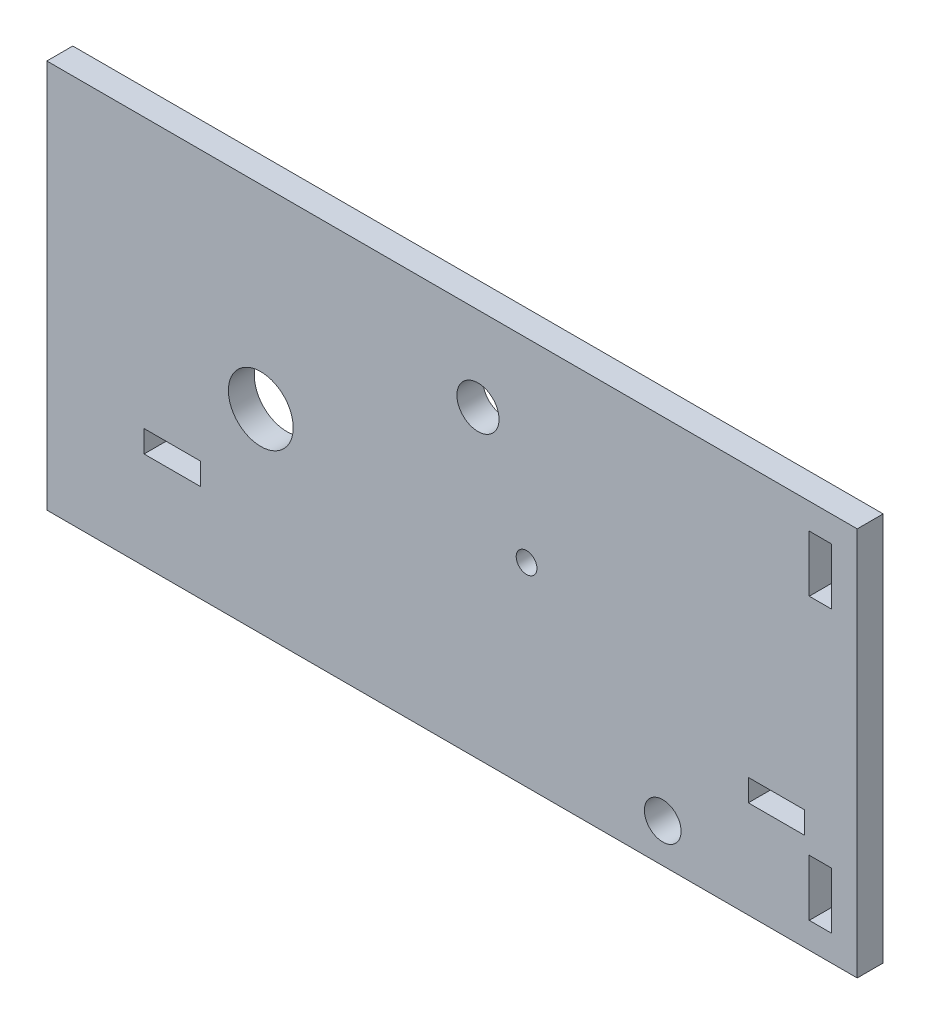
ISO-10303-21;
HEADER;
FILE_DESCRIPTION(('STEP AP214'),'2;1');
FILE_NAME('part.step','',(''),(''),'','','');
FILE_SCHEMA(('AUTOMOTIVE_DESIGN { 1 0 10303 214 1 1 1 1 }'));
ENDSEC;
DATA;
#1=APPLICATION_CONTEXT('core data for automotive mechanical design processes');
#2=APPLICATION_PROTOCOL_DEFINITION('international standard','automotive_design',2000,#1);
#3=PRODUCT_CONTEXT('',#1,'mechanical');
#4=PRODUCT('Part','Part','',(#3));
#5=PRODUCT_RELATED_PRODUCT_CATEGORY('part','',(#4));
#6=PRODUCT_DEFINITION_FORMATION('','',#4);
#7=PRODUCT_DEFINITION_CONTEXT('part definition',#1,'design');
#8=PRODUCT_DEFINITION('design','',#6,#7);
#9=PRODUCT_DEFINITION_SHAPE('','',#8);
#10=(LENGTH_UNIT() NAMED_UNIT(*) SI_UNIT(.MILLI.,.METRE.));
#11=(NAMED_UNIT(*) PLANE_ANGLE_UNIT() SI_UNIT($,.RADIAN.));
#12=(NAMED_UNIT(*) SI_UNIT($,.STERADIAN.) SOLID_ANGLE_UNIT());
#13=UNCERTAINTY_MEASURE_WITH_UNIT(LENGTH_MEASURE(1.E-05),#10,'distance_accuracy_value','');
#14=(GEOMETRIC_REPRESENTATION_CONTEXT(3) GLOBAL_UNCERTAINTY_ASSIGNED_CONTEXT((#13)) GLOBAL_UNIT_ASSIGNED_CONTEXT((#10,
#11,#12)) REPRESENTATION_CONTEXT('',''));
#15=CARTESIAN_POINT('',(0.,0.,0.));
#16=DIRECTION('',(0.,0.,1.));
#17=DIRECTION('',(1.,0.,0.));
#18=AXIS2_PLACEMENT_3D('',#15,#16,#17);
#19=CARTESIAN_POINT('',(0.,0.,4.));
#20=DIRECTION('',(0.,0.,-1.));
#21=DIRECTION('',(-1.,0.,0.));
#22=AXIS2_PLACEMENT_3D('',#19,#20,#21);
#23=PLANE('',#22);
#24=DIRECTION('',(0.,-1.,0.));
#25=VECTOR('',#24,1.);
#26=CARTESIAN_POINT('',(38.6,-17.3,4.));
#27=LINE('',#26,#25);
#28=CARTESIAN_POINT('',(38.6,-17.3,4.));
#29=VERTEX_POINT('',#28);
#30=CARTESIAN_POINT('',(38.6,-26.,4.));
#31=VERTEX_POINT('',#30);
#32=EDGE_CURVE('E211',#29,#31,#27,.T.);
#33=ORIENTED_EDGE('',*,*,#32,.F.);
#34=DIRECTION('',(-1.,0.,0.));
#35=VECTOR('',#34,1.);
#36=CARTESIAN_POINT('',(38.6,-17.3,4.));
#37=LINE('',#36,#35);
#38=CARTESIAN_POINT('',(42.,-17.3,4.));
#39=VERTEX_POINT('',#38);
#40=EDGE_CURVE('E218',#39,#29,#37,.T.);
#41=ORIENTED_EDGE('',*,*,#40,.F.);
#42=DIRECTION('',(0.,1.,0.));
#43=VECTOR('',#42,1.);
#44=CARTESIAN_POINT('',(42.,-17.3,4.));
#45=LINE('',#44,#43);
#46=CARTESIAN_POINT('',(42.,-26.,4.));
#47=VERTEX_POINT('',#46);
#48=EDGE_CURVE('E216',#47,#39,#45,.T.);
#49=ORIENTED_EDGE('',*,*,#48,.F.);
#50=DIRECTION('',(1.,0.,0.));
#51=VECTOR('',#50,1.);
#52=CARTESIAN_POINT('',(38.6,-26.,4.));
#53=LINE('',#52,#51);
#54=EDGE_CURVE('E213',#31,#47,#53,.T.);
#55=ORIENTED_EDGE('',*,*,#54,.F.);
#56=EDGE_LOOP('',(#33,#41,#49,#55));
#57=FACE_BOUND('',#56,.T.);
#58=CARTESIAN_POINT('',(16.,-24.,4.));
#59=DIRECTION('',(0.,0.,1.));
#60=DIRECTION('',(1.,0.,0.));
#61=AXIS2_PLACEMENT_3D('',#58,#59,#60);
#62=CIRCLE('',#61,2.83);
#63=CARTESIAN_POINT('',(18.83,-24.,4.));
#64=VERTEX_POINT('',#63);
#65=EDGE_CURVE('E288',#64,#64,#62,.T.);
#66=ORIENTED_EDGE('',*,*,#65,.F.);
#67=EDGE_LOOP('',(#66));
#68=FACE_BOUND('',#67,.T.);
#69=CARTESIAN_POINT('',(-46.,0.,4.));
#70=DIRECTION('',(0.,0.,1.));
#71=DIRECTION('',(1.,0.,0.));
#72=AXIS2_PLACEMENT_3D('',#69,#70,#71);
#73=CIRCLE('',#72,5.);
#74=CARTESIAN_POINT('',(-41.,0.,4.));
#75=VERTEX_POINT('',#74);
#76=EDGE_CURVE('E294',#75,#75,#73,.T.);
#77=ORIENTED_EDGE('',*,*,#76,.F.);
#78=EDGE_LOOP('',(#77));
#79=FACE_BOUND('',#78,.T.);
#80=CARTESIAN_POINT('',(-12.5,17.,4.));
#81=DIRECTION('',(0.,0.,1.));
#82=DIRECTION('',(1.,0.,0.));
#83=AXIS2_PLACEMENT_3D('',#80,#81,#82);
#84=CIRCLE('',#83,3.25);
#85=CARTESIAN_POINT('',(-9.25,17.,4.));
#86=VERTEX_POINT('',#85);
#87=EDGE_CURVE('E300',#86,#86,#84,.T.);
#88=ORIENTED_EDGE('',*,*,#87,.F.);
#89=EDGE_LOOP('',(#88));
#90=FACE_BOUND('',#89,.T.);
#91=DIRECTION('',(0.,-1.,0.));
#92=VECTOR('',#91,1.);
#93=CARTESIAN_POINT('',(-64.,-11.6,4.));
#94=LINE('',#93,#92);
#95=CARTESIAN_POINT('',(-64.,-11.6,4.));
#96=VERTEX_POINT('',#95);
#97=CARTESIAN_POINT('',(-64.,-15.,4.));
#98=VERTEX_POINT('',#97);
#99=EDGE_CURVE('E306',#96,#98,#94,.T.);
#100=ORIENTED_EDGE('',*,*,#99,.F.);
#101=DIRECTION('',(-1.,0.,0.));
#102=VECTOR('',#101,1.);
#103=CARTESIAN_POINT('',(-64.,-11.6,4.));
#104=LINE('',#103,#102);
#105=CARTESIAN_POINT('',(-55.3,-11.6,4.));
#106=VERTEX_POINT('',#105);
#107=EDGE_CURVE('E314',#106,#96,#104,.T.);
#108=ORIENTED_EDGE('',*,*,#107,.F.);
#109=DIRECTION('',(0.,1.,0.));
#110=VECTOR('',#109,1.);
#111=CARTESIAN_POINT('',(-55.3,-11.6,4.));
#112=LINE('',#111,#110);
#113=CARTESIAN_POINT('',(-55.3,-15.,4.));
#114=VERTEX_POINT('',#113);
#115=EDGE_CURVE('E311',#114,#106,#112,.T.);
#116=ORIENTED_EDGE('',*,*,#115,.F.);
#117=DIRECTION('',(1.,0.,0.));
#118=VECTOR('',#117,1.);
#119=CARTESIAN_POINT('',(-64.,-15.,4.));
#120=LINE('',#119,#118);
#121=EDGE_CURVE('E308',#98,#114,#120,.T.);
#122=ORIENTED_EDGE('',*,*,#121,.F.);
#123=EDGE_LOOP('',(#100,#108,#116,#122));
#124=FACE_BOUND('',#123,.T.);
#125=DIRECTION('',(1.,0.,0.));
#126=VECTOR('',#125,1.);
#127=CARTESIAN_POINT('',(-79.,-30.,4.));
#128=LINE('',#127,#126);
#129=CARTESIAN_POINT('',(-79.,-30.,4.));
#130=VERTEX_POINT('',#129);
#131=CARTESIAN_POINT('',(46.,-30.,4.));
#132=VERTEX_POINT('',#131);
#133=EDGE_CURVE('E342',#130,#132,#128,.T.);
#134=ORIENTED_EDGE('',*,*,#133,.T.);
#135=DIRECTION('',(0.,1.,0.));
#136=VECTOR('',#135,1.);
#137=CARTESIAN_POINT('',(46.,30.,4.));
#138=LINE('',#137,#136);
#139=CARTESIAN_POINT('',(46.,30.,4.));
#140=VERTEX_POINT('',#139);
#141=EDGE_CURVE('E239',#132,#140,#138,.T.);
#142=ORIENTED_EDGE('',*,*,#141,.T.);
#143=DIRECTION('',(-1.,0.,0.));
#144=VECTOR('',#143,1.);
#145=CARTESIAN_POINT('',(-79.,30.,4.));
#146=LINE('',#145,#144);
#147=CARTESIAN_POINT('',(-79.,30.,4.));
#148=VERTEX_POINT('',#147);
#149=EDGE_CURVE('E337',#140,#148,#146,.T.);
#150=ORIENTED_EDGE('',*,*,#149,.T.);
#151=DIRECTION('',(0.,-1.,0.));
#152=VECTOR('',#151,1.);
#153=CARTESIAN_POINT('',(-79.,-30.,4.));
#154=LINE('',#153,#152);
#155=EDGE_CURVE('E339',#148,#130,#154,.T.);
#156=ORIENTED_EDGE('',*,*,#155,.T.);
#157=EDGE_LOOP('',(#134,#142,#150,#156));
#158=FACE_BOUND('',#157,.T.);
#159=DIRECTION('',(0.,-1.,0.));
#160=VECTOR('',#159,1.);
#161=CARTESIAN_POINT('',(29.2,-11.6,4.));
#162=LINE('',#161,#160);
#163=CARTESIAN_POINT('',(29.2,-11.6,4.));
#164=VERTEX_POINT('',#163);
#165=CARTESIAN_POINT('',(29.2,-15.,4.));
#166=VERTEX_POINT('',#165);
#167=EDGE_CURVE('E257',#164,#166,#162,.T.);
#168=ORIENTED_EDGE('',*,*,#167,.F.);
#169=DIRECTION('',(-1.,0.,0.));
#170=VECTOR('',#169,1.);
#171=CARTESIAN_POINT('',(29.2,-11.6,4.));
#172=LINE('',#171,#170);
#173=CARTESIAN_POINT('',(37.9,-11.6,4.));
#174=VERTEX_POINT('',#173);
#175=EDGE_CURVE('E265',#174,#164,#172,.T.);
#176=ORIENTED_EDGE('',*,*,#175,.F.);
#177=DIRECTION('',(0.,1.,0.));
#178=VECTOR('',#177,1.);
#179=CARTESIAN_POINT('',(37.9,-11.6,4.));
#180=LINE('',#179,#178);
#181=CARTESIAN_POINT('',(37.9,-15.,4.));
#182=VERTEX_POINT('',#181);
#183=EDGE_CURVE('E262',#182,#174,#180,.T.);
#184=ORIENTED_EDGE('',*,*,#183,.F.);
#185=DIRECTION('',(1.,0.,0.));
#186=VECTOR('',#185,1.);
#187=CARTESIAN_POINT('',(29.2,-15.,4.));
#188=LINE('',#187,#186);
#189=EDGE_CURVE('E259',#166,#182,#188,.T.);
#190=ORIENTED_EDGE('',*,*,#189,.F.);
#191=EDGE_LOOP('',(#168,#176,#184,#190));
#192=FACE_BOUND('',#191,.T.);
#193=CARTESIAN_POINT('',(-5.,0.,4.));
#194=DIRECTION('',(0.,0.,1.));
#195=DIRECTION('',(1.,0.,0.));
#196=AXIS2_PLACEMENT_3D('',#193,#194,#195);
#197=CIRCLE('',#196,1.6);
#198=CARTESIAN_POINT('',(-3.4,0.,4.));
#199=VERTEX_POINT('',#198);
#200=EDGE_CURVE('E251',#199,#199,#197,.T.);
#201=ORIENTED_EDGE('',*,*,#200,.F.);
#202=EDGE_LOOP('',(#201));
#203=FACE_BOUND('',#202,.T.);
#204=DIRECTION('',(0.,-1.,0.));
#205=VECTOR('',#204,1.);
#206=CARTESIAN_POINT('',(38.6,26.,4.));
#207=LINE('',#206,#205);
#208=CARTESIAN_POINT('',(38.6,26.,4.));
#209=VERTEX_POINT('',#208);
#210=CARTESIAN_POINT('',(38.6,17.3,4.));
#211=VERTEX_POINT('',#210);
#212=EDGE_CURVE('E171',#209,#211,#207,.T.);
#213=ORIENTED_EDGE('',*,*,#212,.F.);
#214=DIRECTION('',(-1.,0.,0.));
#215=VECTOR('',#214,1.);
#216=CARTESIAN_POINT('',(38.6,26.,4.));
#217=LINE('',#216,#215);
#218=CARTESIAN_POINT('',(42.,26.,4.));
#219=VERTEX_POINT('',#218);
#220=EDGE_CURVE('E195',#219,#209,#217,.T.);
#221=ORIENTED_EDGE('',*,*,#220,.F.);
#222=DIRECTION('',(0.,1.,0.));
#223=VECTOR('',#222,1.);
#224=CARTESIAN_POINT('',(42.,26.,4.));
#225=LINE('',#224,#223);
#226=CARTESIAN_POINT('',(42.,17.3,4.));
#227=VERTEX_POINT('',#226);
#228=EDGE_CURVE('E193',#227,#219,#225,.T.);
#229=ORIENTED_EDGE('',*,*,#228,.F.);
#230=DIRECTION('',(1.,0.,0.));
#231=VECTOR('',#230,1.);
#232=CARTESIAN_POINT('',(38.6,17.3,4.));
#233=LINE('',#232,#231);
#234=EDGE_CURVE('E181',#211,#227,#233,.T.);
#235=ORIENTED_EDGE('',*,*,#234,.F.);
#236=EDGE_LOOP('',(#213,#221,#229,#235));
#237=FACE_BOUND('',#236,.T.);
#238=ADVANCED_FACE('F33',(#57,#68,#79,#90,#124,#158,#192,#203,#237),#23,.F.);
#239=CARTESIAN_POINT('',(0.,0.,0.));
#240=DIRECTION('',(0.,0.,-1.));
#241=DIRECTION('',(-1.,0.,0.));
#242=AXIS2_PLACEMENT_3D('',#239,#240,#241);
#243=PLANE('',#242);
#244=DIRECTION('',(-1.,0.,0.));
#245=VECTOR('',#244,1.);
#246=CARTESIAN_POINT('',(29.2,-11.6,0.));
#247=LINE('',#246,#245);
#248=CARTESIAN_POINT('',(37.9,-11.6,0.));
#249=VERTEX_POINT('',#248);
#250=CARTESIAN_POINT('',(29.2,-11.6,0.));
#251=VERTEX_POINT('',#250);
#252=EDGE_CURVE('E260',#249,#251,#247,.T.);
#253=ORIENTED_EDGE('',*,*,#252,.T.);
#254=DIRECTION('',(0.,-1.,0.));
#255=VECTOR('',#254,1.);
#256=CARTESIAN_POINT('',(29.2,-11.6,0.));
#257=LINE('',#256,#255);
#258=CARTESIAN_POINT('',(29.2,-15.,0.));
#259=VERTEX_POINT('',#258);
#260=EDGE_CURVE('E254',#251,#259,#257,.T.);
#261=ORIENTED_EDGE('',*,*,#260,.T.);
#262=DIRECTION('',(1.,0.,0.));
#263=VECTOR('',#262,1.);
#264=CARTESIAN_POINT('',(29.2,-15.,0.));
#265=LINE('',#264,#263);
#266=CARTESIAN_POINT('',(37.9,-15.,0.));
#267=VERTEX_POINT('',#266);
#268=EDGE_CURVE('E270',#259,#267,#265,.T.);
#269=ORIENTED_EDGE('',*,*,#268,.T.);
#270=DIRECTION('',(0.,1.,0.));
#271=VECTOR('',#270,1.);
#272=CARTESIAN_POINT('',(37.9,-11.6,0.));
#273=LINE('',#272,#271);
#274=EDGE_CURVE('E273',#267,#249,#273,.T.);
#275=ORIENTED_EDGE('',*,*,#274,.T.);
#276=EDGE_LOOP('',(#253,#261,#269,#275));
#277=FACE_BOUND('',#276,.T.);
#278=CARTESIAN_POINT('',(16.,-24.,0.));
#279=DIRECTION('',(0.,0.,1.));
#280=DIRECTION('',(1.,0.,0.));
#281=AXIS2_PLACEMENT_3D('',#278,#279,#280);
#282=CIRCLE('',#281,2.83);
#283=CARTESIAN_POINT('',(18.83,-24.,0.));
#284=VERTEX_POINT('',#283);
#285=EDGE_CURVE('E287',#284,#284,#282,.T.);
#286=ORIENTED_EDGE('',*,*,#285,.T.);
#287=EDGE_LOOP('',(#286));
#288=FACE_BOUND('',#287,.T.);
#289=CARTESIAN_POINT('',(-12.5,17.,0.));
#290=DIRECTION('',(0.,0.,1.));
#291=DIRECTION('',(1.,0.,0.));
#292=AXIS2_PLACEMENT_3D('',#289,#290,#291);
#293=CIRCLE('',#292,3.25);
#294=CARTESIAN_POINT('',(-9.25,17.,0.));
#295=VERTEX_POINT('',#294);
#296=EDGE_CURVE('E297',#295,#295,#293,.T.);
#297=ORIENTED_EDGE('',*,*,#296,.T.);
#298=EDGE_LOOP('',(#297));
#299=FACE_BOUND('',#298,.T.);
#300=DIRECTION('',(-1.,0.,0.));
#301=VECTOR('',#300,1.);
#302=CARTESIAN_POINT('',(-79.,30.,0.));
#303=LINE('',#302,#301);
#304=CARTESIAN_POINT('',(46.,30.,0.));
#305=VERTEX_POINT('',#304);
#306=CARTESIAN_POINT('',(-79.,30.,0.));
#307=VERTEX_POINT('',#306);
#308=EDGE_CURVE('E336',#305,#307,#303,.T.);
#309=ORIENTED_EDGE('',*,*,#308,.F.);
#310=DIRECTION('',(0.,1.,0.));
#311=VECTOR('',#310,1.);
#312=CARTESIAN_POINT('',(46.,30.,0.));
#313=LINE('',#312,#311);
#314=CARTESIAN_POINT('',(46.,-30.,0.));
#315=VERTEX_POINT('',#314);
#316=EDGE_CURVE('E189',#315,#305,#313,.T.);
#317=ORIENTED_EDGE('',*,*,#316,.F.);
#318=DIRECTION('',(1.,0.,0.));
#319=VECTOR('',#318,1.);
#320=CARTESIAN_POINT('',(-79.,-30.,0.));
#321=LINE('',#320,#319);
#322=CARTESIAN_POINT('',(-79.,-30.,0.));
#323=VERTEX_POINT('',#322);
#324=EDGE_CURVE('E340',#323,#315,#321,.T.);
#325=ORIENTED_EDGE('',*,*,#324,.F.);
#326=DIRECTION('',(0.,-1.,0.));
#327=VECTOR('',#326,1.);
#328=CARTESIAN_POINT('',(-79.,-30.,0.));
#329=LINE('',#328,#327);
#330=EDGE_CURVE('E345',#307,#323,#329,.T.);
#331=ORIENTED_EDGE('',*,*,#330,.F.);
#332=EDGE_LOOP('',(#309,#317,#325,#331));
#333=FACE_BOUND('',#332,.T.);
#334=DIRECTION('',(-1.,0.,0.));
#335=VECTOR('',#334,1.);
#336=CARTESIAN_POINT('',(-64.,-11.6,0.));
#337=LINE('',#336,#335);
#338=CARTESIAN_POINT('',(-55.3,-11.6,0.));
#339=VERTEX_POINT('',#338);
#340=CARTESIAN_POINT('',(-64.,-11.6,0.));
#341=VERTEX_POINT('',#340);
#342=EDGE_CURVE('E309',#339,#341,#337,.T.);
#343=ORIENTED_EDGE('',*,*,#342,.T.);
#344=DIRECTION('',(0.,-1.,0.));
#345=VECTOR('',#344,1.);
#346=CARTESIAN_POINT('',(-64.,-11.6,0.));
#347=LINE('',#346,#345);
#348=CARTESIAN_POINT('',(-64.,-15.,0.));
#349=VERTEX_POINT('',#348);
#350=EDGE_CURVE('E303',#341,#349,#347,.T.);
#351=ORIENTED_EDGE('',*,*,#350,.T.);
#352=DIRECTION('',(1.,0.,0.));
#353=VECTOR('',#352,1.);
#354=CARTESIAN_POINT('',(-64.,-15.,0.));
#355=LINE('',#354,#353);
#356=CARTESIAN_POINT('',(-55.3,-15.,0.));
#357=VERTEX_POINT('',#356);
#358=EDGE_CURVE('E319',#349,#357,#355,.T.);
#359=ORIENTED_EDGE('',*,*,#358,.T.);
#360=DIRECTION('',(0.,1.,0.));
#361=VECTOR('',#360,1.);
#362=CARTESIAN_POINT('',(-55.3,-11.6,0.));
#363=LINE('',#362,#361);
#364=EDGE_CURVE('E322',#357,#339,#363,.T.);
#365=ORIENTED_EDGE('',*,*,#364,.T.);
#366=EDGE_LOOP('',(#343,#351,#359,#365));
#367=FACE_BOUND('',#366,.T.);
#368=CARTESIAN_POINT('',(-46.,0.,0.));
#369=DIRECTION('',(0.,0.,1.));
#370=DIRECTION('',(1.,0.,0.));
#371=AXIS2_PLACEMENT_3D('',#368,#369,#370);
#372=CIRCLE('',#371,5.);
#373=CARTESIAN_POINT('',(-41.,0.,0.));
#374=VERTEX_POINT('',#373);
#375=EDGE_CURVE('E291',#374,#374,#372,.T.);
#376=ORIENTED_EDGE('',*,*,#375,.T.);
#377=EDGE_LOOP('',(#376));
#378=FACE_BOUND('',#377,.T.);
#379=CARTESIAN_POINT('',(-5.,0.,0.));
#380=DIRECTION('',(0.,0.,1.));
#381=DIRECTION('',(1.,0.,0.));
#382=AXIS2_PLACEMENT_3D('',#379,#380,#381);
#383=CIRCLE('',#382,1.6);
#384=CARTESIAN_POINT('',(-3.4,0.,0.));
#385=VERTEX_POINT('',#384);
#386=EDGE_CURVE('E250',#385,#385,#383,.T.);
#387=ORIENTED_EDGE('',*,*,#386,.T.);
#388=EDGE_LOOP('',(#387));
#389=FACE_BOUND('',#388,.T.);
#390=DIRECTION('',(-1.,0.,0.));
#391=VECTOR('',#390,1.);
#392=CARTESIAN_POINT('',(38.6,-17.3,0.));
#393=LINE('',#392,#391);
#394=CARTESIAN_POINT('',(42.,-17.3,0.));
#395=VERTEX_POINT('',#394);
#396=CARTESIAN_POINT('',(38.6,-17.3,0.));
#397=VERTEX_POINT('',#396);
#398=EDGE_CURVE('E214',#395,#397,#393,.T.);
#399=ORIENTED_EDGE('',*,*,#398,.T.);
#400=DIRECTION('',(0.,-1.,0.));
#401=VECTOR('',#400,1.);
#402=CARTESIAN_POINT('',(38.6,-17.3,0.));
#403=LINE('',#402,#401);
#404=CARTESIAN_POINT('',(38.6,-26.,0.));
#405=VERTEX_POINT('',#404);
#406=EDGE_CURVE('E221',#397,#405,#403,.T.);
#407=ORIENTED_EDGE('',*,*,#406,.T.);
#408=DIRECTION('',(1.,0.,0.));
#409=VECTOR('',#408,1.);
#410=CARTESIAN_POINT('',(38.6,-26.,0.));
#411=LINE('',#410,#409);
#412=CARTESIAN_POINT('',(42.,-26.,0.));
#413=VERTEX_POINT('',#412);
#414=EDGE_CURVE('E224',#405,#413,#411,.T.);
#415=ORIENTED_EDGE('',*,*,#414,.T.);
#416=DIRECTION('',(0.,1.,0.));
#417=VECTOR('',#416,1.);
#418=CARTESIAN_POINT('',(42.,-17.3,0.));
#419=LINE('',#418,#417);
#420=EDGE_CURVE('E227',#413,#395,#419,.T.);
#421=ORIENTED_EDGE('',*,*,#420,.T.);
#422=EDGE_LOOP('',(#399,#407,#415,#421));
#423=FACE_BOUND('',#422,.T.);
#424=DIRECTION('',(-1.,0.,0.));
#425=VECTOR('',#424,1.);
#426=CARTESIAN_POINT('',(38.6,26.,0.));
#427=LINE('',#426,#425);
#428=CARTESIAN_POINT('',(42.,26.,0.));
#429=VERTEX_POINT('',#428);
#430=CARTESIAN_POINT('',(38.6,26.,0.));
#431=VERTEX_POINT('',#430);
#432=EDGE_CURVE('E182',#429,#431,#427,.T.);
#433=ORIENTED_EDGE('',*,*,#432,.T.);
#434=DIRECTION('',(0.,-1.,0.));
#435=VECTOR('',#434,1.);
#436=CARTESIAN_POINT('',(38.6,26.,0.));
#437=LINE('',#436,#435);
#438=CARTESIAN_POINT('',(38.6,17.3,0.));
#439=VERTEX_POINT('',#438);
#440=EDGE_CURVE('E199',#431,#439,#437,.T.);
#441=ORIENTED_EDGE('',*,*,#440,.T.);
#442=DIRECTION('',(1.,0.,0.));
#443=VECTOR('',#442,1.);
#444=CARTESIAN_POINT('',(38.6,17.3,0.));
#445=LINE('',#444,#443);
#446=CARTESIAN_POINT('',(42.,17.3,0.));
#447=VERTEX_POINT('',#446);
#448=EDGE_CURVE('E188',#439,#447,#445,.T.);
#449=ORIENTED_EDGE('',*,*,#448,.T.);
#450=DIRECTION('',(0.,1.,0.));
#451=VECTOR('',#450,1.);
#452=CARTESIAN_POINT('',(42.,26.,0.));
#453=LINE('',#452,#451);
#454=EDGE_CURVE('E203',#447,#429,#453,.T.);
#455=ORIENTED_EDGE('',*,*,#454,.T.);
#456=EDGE_LOOP('',(#433,#441,#449,#455));
#457=FACE_BOUND('',#456,.T.);
#458=ADVANCED_FACE('F359',(#277,#288,#299,#333,#367,#378,#389,#423,#457),#243,.T.);
#459=CARTESIAN_POINT('',(-79.,30.,4.));
#460=DIRECTION('',(0.,-1.,0.));
#461=DIRECTION('',(0.,0.,-1.));
#462=AXIS2_PLACEMENT_3D('',#459,#460,#461);
#463=PLANE('',#462);
#464=ORIENTED_EDGE('',*,*,#308,.T.);
#465=DIRECTION('',(0.,0.,-1.));
#466=VECTOR('',#465,1.);
#467=CARTESIAN_POINT('',(-79.,30.,4.));
#468=LINE('',#467,#466);
#469=EDGE_CURVE('E11',#148,#307,#468,.T.);
#470=ORIENTED_EDGE('',*,*,#469,.F.);
#471=ORIENTED_EDGE('',*,*,#149,.F.);
#472=DIRECTION('',(0.,0.,-1.));
#473=VECTOR('',#472,1.);
#474=CARTESIAN_POINT('',(46.,30.,4.));
#475=LINE('',#474,#473);
#476=EDGE_CURVE('E242',#140,#305,#475,.T.);
#477=ORIENTED_EDGE('',*,*,#476,.T.);
#478=EDGE_LOOP('',(#464,#470,#471,#477));
#479=FACE_BOUND('',#478,.T.);
#480=ADVANCED_FACE('F35',(#479),#463,.F.);
#481=CARTESIAN_POINT('',(-79.,-30.,4.));
#482=DIRECTION('',(1.,0.,0.));
#483=DIRECTION('',(0.,0.,-1.));
#484=AXIS2_PLACEMENT_3D('',#481,#482,#483);
#485=PLANE('',#484);
#486=ORIENTED_EDGE('',*,*,#330,.T.);
#487=DIRECTION('',(0.,0.,-1.));
#488=VECTOR('',#487,1.);
#489=CARTESIAN_POINT('',(-79.,-30.,4.));
#490=LINE('',#489,#488);
#491=EDGE_CURVE('E41',#130,#323,#490,.T.);
#492=ORIENTED_EDGE('',*,*,#491,.F.);
#493=ORIENTED_EDGE('',*,*,#155,.F.);
#494=ORIENTED_EDGE('',*,*,#469,.T.);
#495=EDGE_LOOP('',(#486,#492,#493,#494));
#496=FACE_BOUND('',#495,.T.);
#497=ADVANCED_FACE('F369',(#496),#485,.F.);
#498=CARTESIAN_POINT('',(-79.,-30.,4.));
#499=DIRECTION('',(0.,1.,0.));
#500=DIRECTION('',(0.,0.,1.));
#501=AXIS2_PLACEMENT_3D('',#498,#499,#500);
#502=PLANE('',#501);
#503=ORIENTED_EDGE('',*,*,#324,.T.);
#504=DIRECTION('',(0.,0.,-1.));
#505=VECTOR('',#504,1.);
#506=CARTESIAN_POINT('',(46.,-30.,4.));
#507=LINE('',#506,#505);
#508=EDGE_CURVE('E247',#132,#315,#507,.T.);
#509=ORIENTED_EDGE('',*,*,#508,.F.);
#510=ORIENTED_EDGE('',*,*,#133,.F.);
#511=ORIENTED_EDGE('',*,*,#491,.T.);
#512=EDGE_LOOP('',(#503,#509,#510,#511));
#513=FACE_BOUND('',#512,.T.);
#514=ADVANCED_FACE('F352',(#513),#502,.F.);
#515=CARTESIAN_POINT('',(-64.,-11.6,4.));
#516=DIRECTION('',(1.,0.,0.));
#517=DIRECTION('',(0.,0.,-1.));
#518=AXIS2_PLACEMENT_3D('',#515,#516,#517);
#519=PLANE('',#518);
#520=ORIENTED_EDGE('',*,*,#350,.F.);
#521=DIRECTION('',(0.,0.,-1.));
#522=VECTOR('',#521,1.);
#523=CARTESIAN_POINT('',(-64.,-11.6,4.));
#524=LINE('',#523,#522);
#525=EDGE_CURVE('E316',#96,#341,#524,.T.);
#526=ORIENTED_EDGE('',*,*,#525,.F.);
#527=ORIENTED_EDGE('',*,*,#99,.T.);
#528=DIRECTION('',(0.,0.,-1.));
#529=VECTOR('',#528,1.);
#530=CARTESIAN_POINT('',(-64.,-15.,4.));
#531=LINE('',#530,#529);
#532=EDGE_CURVE('E333',#98,#349,#531,.T.);
#533=ORIENTED_EDGE('',*,*,#532,.T.);
#534=EDGE_LOOP('',(#520,#526,#527,#533));
#535=FACE_BOUND('',#534,.T.);
#536=ADVANCED_FACE('F375',(#535),#519,.T.);
#537=CARTESIAN_POINT('',(-64.,-15.,4.));
#538=DIRECTION('',(0.,1.,0.));
#539=DIRECTION('',(-1.,0.,0.));
#540=AXIS2_PLACEMENT_3D('',#537,#538,#539);
#541=PLANE('',#540);
#542=ORIENTED_EDGE('',*,*,#358,.F.);
#543=ORIENTED_EDGE('',*,*,#532,.F.);
#544=ORIENTED_EDGE('',*,*,#121,.T.);
#545=DIRECTION('',(0.,0.,-1.));
#546=VECTOR('',#545,1.);
#547=CARTESIAN_POINT('',(-55.3,-15.,4.));
#548=LINE('',#547,#546);
#549=EDGE_CURVE('E331',#114,#357,#548,.T.);
#550=ORIENTED_EDGE('',*,*,#549,.T.);
#551=EDGE_LOOP('',(#542,#543,#544,#550));
#552=FACE_BOUND('',#551,.T.);
#553=ADVANCED_FACE('F390',(#552),#541,.T.);
#554=CARTESIAN_POINT('',(-55.3,-11.6,4.));
#555=DIRECTION('',(-1.,0.,0.));
#556=DIRECTION('',(0.,0.,1.));
#557=AXIS2_PLACEMENT_3D('',#554,#555,#556);
#558=PLANE('',#557);
#559=ORIENTED_EDGE('',*,*,#364,.F.);
#560=ORIENTED_EDGE('',*,*,#549,.F.);
#561=ORIENTED_EDGE('',*,*,#115,.T.);
#562=DIRECTION('',(0.,0.,-1.));
#563=VECTOR('',#562,1.);
#564=CARTESIAN_POINT('',(-55.3,-11.6,4.));
#565=LINE('',#564,#563);
#566=EDGE_CURVE('E329',#106,#339,#565,.T.);
#567=ORIENTED_EDGE('',*,*,#566,.T.);
#568=EDGE_LOOP('',(#559,#560,#561,#567));
#569=FACE_BOUND('',#568,.T.);
#570=ADVANCED_FACE('F394',(#569),#558,.T.);
#571=CARTESIAN_POINT('',(-64.,-11.6,4.));
#572=DIRECTION('',(0.,-1.,0.));
#573=DIRECTION('',(1.,0.,0.));
#574=AXIS2_PLACEMENT_3D('',#571,#572,#573);
#575=PLANE('',#574);
#576=ORIENTED_EDGE('',*,*,#342,.F.);
#577=ORIENTED_EDGE('',*,*,#566,.F.);
#578=ORIENTED_EDGE('',*,*,#107,.T.);
#579=ORIENTED_EDGE('',*,*,#525,.T.);
#580=EDGE_LOOP('',(#576,#577,#578,#579));
#581=FACE_BOUND('',#580,.T.);
#582=ADVANCED_FACE('F398',(#581),#575,.T.);
#583=CARTESIAN_POINT('',(-12.5,17.,4.));
#584=DIRECTION('',(0.,0.,-1.));
#585=DIRECTION('',(-1.,0.,0.));
#586=AXIS2_PLACEMENT_3D('',#583,#584,#585);
#587=CYLINDRICAL_SURFACE('',#586,3.25);
#588=ORIENTED_EDGE('',*,*,#87,.T.);
#589=EDGE_LOOP('',(#588));
#590=FACE_BOUND('',#589,.T.);
#591=ORIENTED_EDGE('',*,*,#296,.F.);
#592=EDGE_LOOP('',(#591));
#593=FACE_BOUND('',#592,.T.);
#594=ADVANCED_FACE('F402',(#590,#593),#587,.F.);
#595=CARTESIAN_POINT('',(-46.,0.,4.));
#596=DIRECTION('',(0.,0.,-1.));
#597=DIRECTION('',(-1.,0.,0.));
#598=AXIS2_PLACEMENT_3D('',#595,#596,#597);
#599=CYLINDRICAL_SURFACE('',#598,5.);
#600=ORIENTED_EDGE('',*,*,#76,.T.);
#601=EDGE_LOOP('',(#600));
#602=FACE_BOUND('',#601,.T.);
#603=ORIENTED_EDGE('',*,*,#375,.F.);
#604=EDGE_LOOP('',(#603));
#605=FACE_BOUND('',#604,.T.);
#606=ADVANCED_FACE('F406',(#602,#605),#599,.F.);
#607=CARTESIAN_POINT('',(16.,-24.,4.));
#608=DIRECTION('',(0.,0.,-1.));
#609=DIRECTION('',(-1.,0.,0.));
#610=AXIS2_PLACEMENT_3D('',#607,#608,#609);
#611=CYLINDRICAL_SURFACE('',#610,2.83);
#612=ORIENTED_EDGE('',*,*,#65,.T.);
#613=EDGE_LOOP('',(#612));
#614=FACE_BOUND('',#613,.T.);
#615=ORIENTED_EDGE('',*,*,#285,.F.);
#616=EDGE_LOOP('',(#615));
#617=FACE_BOUND('',#616,.T.);
#618=ADVANCED_FACE('F410',(#614,#617),#611,.F.);
#619=CARTESIAN_POINT('',(29.2,-11.6,4.));
#620=DIRECTION('',(1.,0.,0.));
#621=DIRECTION('',(0.,0.,-1.));
#622=AXIS2_PLACEMENT_3D('',#619,#620,#621);
#623=PLANE('',#622);
#624=ORIENTED_EDGE('',*,*,#260,.F.);
#625=DIRECTION('',(0.,0.,-1.));
#626=VECTOR('',#625,1.);
#627=CARTESIAN_POINT('',(29.2,-11.6,4.));
#628=LINE('',#627,#626);
#629=EDGE_CURVE('E267',#164,#251,#628,.T.);
#630=ORIENTED_EDGE('',*,*,#629,.F.);
#631=ORIENTED_EDGE('',*,*,#167,.T.);
#632=DIRECTION('',(0.,0.,-1.));
#633=VECTOR('',#632,1.);
#634=CARTESIAN_POINT('',(29.2,-15.,4.));
#635=LINE('',#634,#633);
#636=EDGE_CURVE('E284',#166,#259,#635,.T.);
#637=ORIENTED_EDGE('',*,*,#636,.T.);
#638=EDGE_LOOP('',(#624,#630,#631,#637));
#639=FACE_BOUND('',#638,.T.);
#640=ADVANCED_FACE('F414',(#639),#623,.T.);
#641=CARTESIAN_POINT('',(29.2,-15.,4.));
#642=DIRECTION('',(0.,1.,0.));
#643=DIRECTION('',(0.,0.,1.));
#644=AXIS2_PLACEMENT_3D('',#641,#642,#643);
#645=PLANE('',#644);
#646=ORIENTED_EDGE('',*,*,#268,.F.);
#647=ORIENTED_EDGE('',*,*,#636,.F.);
#648=ORIENTED_EDGE('',*,*,#189,.T.);
#649=DIRECTION('',(0.,0.,-1.));
#650=VECTOR('',#649,1.);
#651=CARTESIAN_POINT('',(37.9,-15.,4.));
#652=LINE('',#651,#650);
#653=EDGE_CURVE('E282',#182,#267,#652,.T.);
#654=ORIENTED_EDGE('',*,*,#653,.T.);
#655=EDGE_LOOP('',(#646,#647,#648,#654));
#656=FACE_BOUND('',#655,.T.);
#657=ADVANCED_FACE('F418',(#656),#645,.T.);
#658=CARTESIAN_POINT('',(37.9,-11.6,4.));
#659=DIRECTION('',(-1.,0.,0.));
#660=DIRECTION('',(0.,0.,1.));
#661=AXIS2_PLACEMENT_3D('',#658,#659,#660);
#662=PLANE('',#661);
#663=ORIENTED_EDGE('',*,*,#274,.F.);
#664=ORIENTED_EDGE('',*,*,#653,.F.);
#665=ORIENTED_EDGE('',*,*,#183,.T.);
#666=DIRECTION('',(0.,0.,-1.));
#667=VECTOR('',#666,1.);
#668=CARTESIAN_POINT('',(37.9,-11.6,4.));
#669=LINE('',#668,#667);
#670=EDGE_CURVE('E280',#174,#249,#669,.T.);
#671=ORIENTED_EDGE('',*,*,#670,.T.);
#672=EDGE_LOOP('',(#663,#664,#665,#671));
#673=FACE_BOUND('',#672,.T.);
#674=ADVANCED_FACE('F422',(#673),#662,.T.);
#675=CARTESIAN_POINT('',(29.2,-11.6,4.));
#676=DIRECTION('',(0.,-1.,0.));
#677=DIRECTION('',(0.,0.,-1.));
#678=AXIS2_PLACEMENT_3D('',#675,#676,#677);
#679=PLANE('',#678);
#680=ORIENTED_EDGE('',*,*,#252,.F.);
#681=ORIENTED_EDGE('',*,*,#670,.F.);
#682=ORIENTED_EDGE('',*,*,#175,.T.);
#683=ORIENTED_EDGE('',*,*,#629,.T.);
#684=EDGE_LOOP('',(#680,#681,#682,#683));
#685=FACE_BOUND('',#684,.T.);
#686=ADVANCED_FACE('F426',(#685),#679,.T.);
#687=CARTESIAN_POINT('',(-5.,0.,4.));
#688=DIRECTION('',(0.,0.,-1.));
#689=DIRECTION('',(-1.,0.,0.));
#690=AXIS2_PLACEMENT_3D('',#687,#688,#689);
#691=CYLINDRICAL_SURFACE('',#690,1.6);
#692=ORIENTED_EDGE('',*,*,#200,.T.);
#693=EDGE_LOOP('',(#692));
#694=FACE_BOUND('',#693,.T.);
#695=ORIENTED_EDGE('',*,*,#386,.F.);
#696=EDGE_LOOP('',(#695));
#697=FACE_BOUND('',#696,.T.);
#698=ADVANCED_FACE('F430',(#694,#697),#691,.F.);
#699=CARTESIAN_POINT('',(46.,30.,4.));
#700=DIRECTION('',(-1.,0.,0.));
#701=DIRECTION('',(0.,-1.,0.));
#702=AXIS2_PLACEMENT_3D('',#699,#700,#701);
#703=PLANE('',#702);
#704=ORIENTED_EDGE('',*,*,#316,.T.);
#705=ORIENTED_EDGE('',*,*,#476,.F.);
#706=ORIENTED_EDGE('',*,*,#141,.F.);
#707=ORIENTED_EDGE('',*,*,#508,.T.);
#708=EDGE_LOOP('',(#704,#705,#706,#707));
#709=FACE_BOUND('',#708,.T.);
#710=ADVANCED_FACE('F363',(#709),#703,.F.);
#711=CARTESIAN_POINT('',(38.6,-17.3,4.));
#712=DIRECTION('',(1.,0.,0.));
#713=DIRECTION('',(0.,0.,-1.));
#714=AXIS2_PLACEMENT_3D('',#711,#712,#713);
#715=PLANE('',#714);
#716=ORIENTED_EDGE('',*,*,#406,.F.);
#717=DIRECTION('',(0.,0.,-1.));
#718=VECTOR('',#717,1.);
#719=CARTESIAN_POINT('',(38.6,-17.3,4.));
#720=LINE('',#719,#718);
#721=EDGE_CURVE('E220',#29,#397,#720,.T.);
#722=ORIENTED_EDGE('',*,*,#721,.F.);
#723=ORIENTED_EDGE('',*,*,#32,.T.);
#724=DIRECTION('',(0.,0.,-1.));
#725=VECTOR('',#724,1.);
#726=CARTESIAN_POINT('',(38.6,-26.,4.));
#727=LINE('',#726,#725);
#728=EDGE_CURVE('E201',#31,#405,#727,.T.);
#729=ORIENTED_EDGE('',*,*,#728,.T.);
#730=EDGE_LOOP('',(#716,#722,#723,#729));
#731=FACE_BOUND('',#730,.T.);
#732=ADVANCED_FACE('F437',(#731),#715,.T.);
#733=CARTESIAN_POINT('',(38.6,-26.,4.));
#734=DIRECTION('',(0.,1.,0.));
#735=DIRECTION('',(0.,0.,1.));
#736=AXIS2_PLACEMENT_3D('',#733,#734,#735);
#737=PLANE('',#736);
#738=ORIENTED_EDGE('',*,*,#414,.F.);
#739=ORIENTED_EDGE('',*,*,#728,.F.);
#740=ORIENTED_EDGE('',*,*,#54,.T.);
#741=DIRECTION('',(0.,0.,-1.));
#742=VECTOR('',#741,1.);
#743=CARTESIAN_POINT('',(42.,-26.,4.));
#744=LINE('',#743,#742);
#745=EDGE_CURVE('E235',#47,#413,#744,.T.);
#746=ORIENTED_EDGE('',*,*,#745,.T.);
#747=EDGE_LOOP('',(#738,#739,#740,#746));
#748=FACE_BOUND('',#747,.T.);
#749=ADVANCED_FACE('F440',(#748),#737,.T.);
#750=CARTESIAN_POINT('',(42.,-17.3,4.));
#751=DIRECTION('',(-1.,0.,0.));
#752=DIRECTION('',(0.,0.,1.));
#753=AXIS2_PLACEMENT_3D('',#750,#751,#752);
#754=PLANE('',#753);
#755=ORIENTED_EDGE('',*,*,#420,.F.);
#756=ORIENTED_EDGE('',*,*,#745,.F.);
#757=ORIENTED_EDGE('',*,*,#48,.T.);
#758=DIRECTION('',(0.,0.,-1.));
#759=VECTOR('',#758,1.);
#760=CARTESIAN_POINT('',(42.,-17.3,4.));
#761=LINE('',#760,#759);
#762=EDGE_CURVE('E56',#39,#395,#761,.T.);
#763=ORIENTED_EDGE('',*,*,#762,.T.);
#764=EDGE_LOOP('',(#755,#756,#757,#763));
#765=FACE_BOUND('',#764,.T.);
#766=ADVANCED_FACE('F444',(#765),#754,.T.);
#767=CARTESIAN_POINT('',(38.6,-17.3,4.));
#768=DIRECTION('',(0.,-1.,0.));
#769=DIRECTION('',(1.,0.,0.));
#770=AXIS2_PLACEMENT_3D('',#767,#768,#769);
#771=PLANE('',#770);
#772=ORIENTED_EDGE('',*,*,#398,.F.);
#773=ORIENTED_EDGE('',*,*,#762,.F.);
#774=ORIENTED_EDGE('',*,*,#40,.T.);
#775=ORIENTED_EDGE('',*,*,#721,.T.);
#776=EDGE_LOOP('',(#772,#773,#774,#775));
#777=FACE_BOUND('',#776,.T.);
#778=ADVANCED_FACE('F448',(#777),#771,.T.);
#779=CARTESIAN_POINT('',(38.6,26.,4.));
#780=DIRECTION('',(1.,0.,0.));
#781=DIRECTION('',(0.,0.,-1.));
#782=AXIS2_PLACEMENT_3D('',#779,#780,#781);
#783=PLANE('',#782);
#784=ORIENTED_EDGE('',*,*,#440,.F.);
#785=DIRECTION('',(0.,0.,-1.));
#786=VECTOR('',#785,1.);
#787=CARTESIAN_POINT('',(38.6,26.,4.));
#788=LINE('',#787,#786);
#789=EDGE_CURVE('E177',#209,#431,#788,.T.);
#790=ORIENTED_EDGE('',*,*,#789,.F.);
#791=ORIENTED_EDGE('',*,*,#212,.T.);
#792=DIRECTION('',(0.,0.,-1.));
#793=VECTOR('',#792,1.);
#794=CARTESIAN_POINT('',(38.6,17.3,4.));
#795=LINE('',#794,#793);
#796=EDGE_CURVE('E174',#211,#439,#795,.T.);
#797=ORIENTED_EDGE('',*,*,#796,.T.);
#798=EDGE_LOOP('',(#784,#790,#791,#797));
#799=FACE_BOUND('',#798,.T.);
#800=ADVANCED_FACE('F173',(#799),#783,.T.);
#801=CARTESIAN_POINT('',(38.6,17.3,4.));
#802=DIRECTION('',(0.,1.,0.));
#803=DIRECTION('',(-1.,0.,0.));
#804=AXIS2_PLACEMENT_3D('',#801,#802,#803);
#805=PLANE('',#804);
#806=ORIENTED_EDGE('',*,*,#448,.F.);
#807=ORIENTED_EDGE('',*,*,#796,.F.);
#808=ORIENTED_EDGE('',*,*,#234,.T.);
#809=DIRECTION('',(0.,0.,-1.));
#810=VECTOR('',#809,1.);
#811=CARTESIAN_POINT('',(42.,17.3,4.));
#812=LINE('',#811,#810);
#813=EDGE_CURVE('E190',#227,#447,#812,.T.);
#814=ORIENTED_EDGE('',*,*,#813,.T.);
#815=EDGE_LOOP('',(#806,#807,#808,#814));
#816=FACE_BOUND('',#815,.T.);
#817=ADVANCED_FACE('F185',(#816),#805,.T.);
#818=CARTESIAN_POINT('',(42.,26.,4.));
#819=DIRECTION('',(-1.,0.,0.));
#820=DIRECTION('',(0.,0.,1.));
#821=AXIS2_PLACEMENT_3D('',#818,#819,#820);
#822=PLANE('',#821);
#823=ORIENTED_EDGE('',*,*,#454,.F.);
#824=ORIENTED_EDGE('',*,*,#813,.F.);
#825=ORIENTED_EDGE('',*,*,#228,.T.);
#826=DIRECTION('',(0.,0.,-1.));
#827=VECTOR('',#826,1.);
#828=CARTESIAN_POINT('',(42.,26.,4.));
#829=LINE('',#828,#827);
#830=EDGE_CURVE('E48',#219,#429,#829,.T.);
#831=ORIENTED_EDGE('',*,*,#830,.T.);
#832=EDGE_LOOP('',(#823,#824,#825,#831));
#833=FACE_BOUND('',#832,.T.);
#834=ADVANCED_FACE('F456',(#833),#822,.T.);
#835=CARTESIAN_POINT('',(38.6,26.,4.));
#836=DIRECTION('',(0.,-1.,0.));
#837=DIRECTION('',(0.,0.,-1.));
#838=AXIS2_PLACEMENT_3D('',#835,#836,#837);
#839=PLANE('',#838);
#840=ORIENTED_EDGE('',*,*,#432,.F.);
#841=ORIENTED_EDGE('',*,*,#830,.F.);
#842=ORIENTED_EDGE('',*,*,#220,.T.);
#843=ORIENTED_EDGE('',*,*,#789,.T.);
#844=EDGE_LOOP('',(#840,#841,#842,#843));
#845=FACE_BOUND('',#844,.T.);
#846=ADVANCED_FACE('F459',(#845),#839,.T.);
#847=CLOSED_SHELL('',(#238,#458,#480,#497,#514,#536,#553,#570,#582,#594,#606,#618,#640,#657,
#674,#686,#698,#710,#732,#749,#766,#778,#800,#817,#834,#846));
#848=MANIFOLD_SOLID_BREP('B2',#847);
#849=ADVANCED_BREP_SHAPE_REPRESENTATION('',(#18,#848),#14);
#850=SHAPE_DEFINITION_REPRESENTATION(#9,#849);
ENDSEC;
END-ISO-10303-21;
